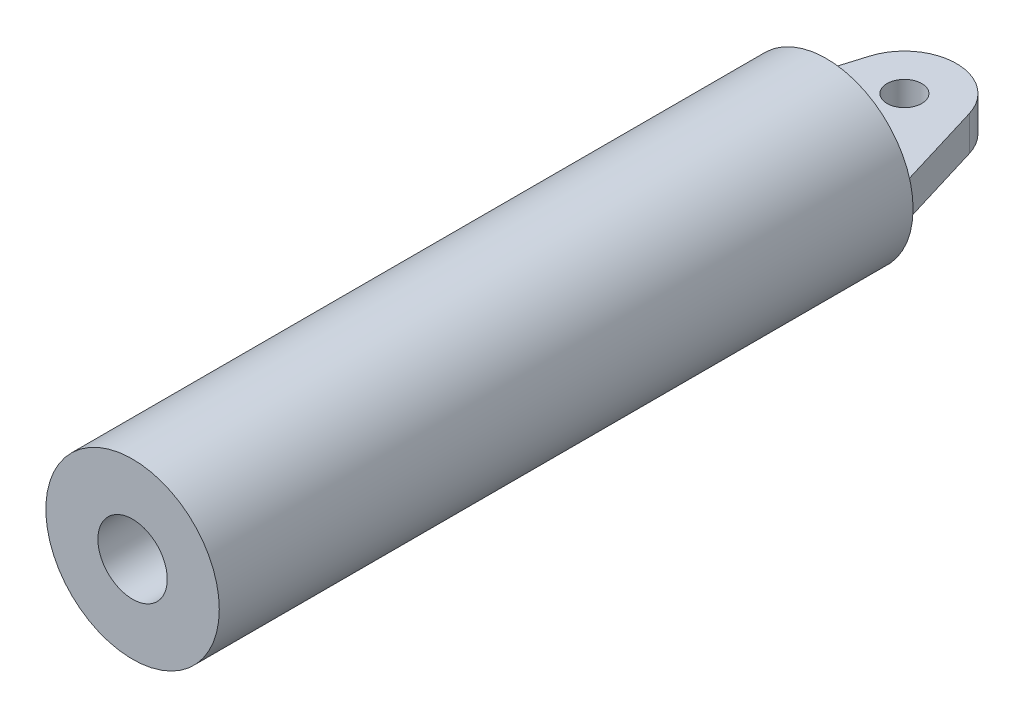
ISO-10303-21;
HEADER;
FILE_DESCRIPTION(('STEP AP214'),'2;1');
FILE_NAME('part.step','',(''),(''),'','','');
FILE_SCHEMA(('AUTOMOTIVE_DESIGN { 1 0 10303 214 1 1 1 1 }'));
ENDSEC;
DATA;
#1=APPLICATION_CONTEXT('core data for automotive mechanical design processes');
#2=APPLICATION_PROTOCOL_DEFINITION('international standard','automotive_design',2000,#1);
#3=PRODUCT_CONTEXT('',#1,'mechanical');
#4=PRODUCT('Part','Part','',(#3));
#5=PRODUCT_RELATED_PRODUCT_CATEGORY('part','',(#4));
#6=PRODUCT_DEFINITION_FORMATION('','',#4);
#7=PRODUCT_DEFINITION_CONTEXT('part definition',#1,'design');
#8=PRODUCT_DEFINITION('design','',#6,#7);
#9=PRODUCT_DEFINITION_SHAPE('','',#8);
#10=(LENGTH_UNIT() NAMED_UNIT(*) SI_UNIT(.MILLI.,.METRE.));
#11=(NAMED_UNIT(*) PLANE_ANGLE_UNIT() SI_UNIT($,.RADIAN.));
#12=(NAMED_UNIT(*) SI_UNIT($,.STERADIAN.) SOLID_ANGLE_UNIT());
#13=UNCERTAINTY_MEASURE_WITH_UNIT(LENGTH_MEASURE(1.E-05),#10,'distance_accuracy_value','');
#14=(GEOMETRIC_REPRESENTATION_CONTEXT(3) GLOBAL_UNCERTAINTY_ASSIGNED_CONTEXT((#13)) GLOBAL_UNIT_ASSIGNED_CONTEXT((#10,
#11,#12)) REPRESENTATION_CONTEXT('',''));
#15=CARTESIAN_POINT('',(0.,0.,0.));
#16=DIRECTION('',(0.,0.,1.));
#17=DIRECTION('',(1.,0.,0.));
#18=AXIS2_PLACEMENT_3D('',#15,#16,#17);
#19=CARTESIAN_POINT('',(0.,0.,400.));
#20=DIRECTION('',(0.,0.,-1.));
#21=DIRECTION('',(-1.,0.,0.));
#22=AXIS2_PLACEMENT_3D('',#19,#20,#21);
#23=CYLINDRICAL_SURFACE('',#22,50.);
#24=CARTESIAN_POINT('',(0.,0.,400.));
#25=DIRECTION('',(0.,0.,1.));
#26=DIRECTION('',(1.,0.,0.));
#27=AXIS2_PLACEMENT_3D('',#24,#25,#26);
#28=CIRCLE('',#27,50.);
#29=CARTESIAN_POINT('',(50.,0.,400.));
#30=VERTEX_POINT('',#29);
#31=EDGE_CURVE('E11',#30,#30,#28,.T.);
#32=ORIENTED_EDGE('',*,*,#31,.F.);
#33=EDGE_LOOP('',(#32));
#34=FACE_BOUND('',#33,.T.);
#35=CARTESIAN_POINT('',(0.,0.,0.));
#36=DIRECTION('',(0.,0.,1.));
#37=DIRECTION('',(1.,0.,0.));
#38=AXIS2_PLACEMENT_3D('',#35,#36,#37);
#39=CIRCLE('',#38,50.);
#40=CARTESIAN_POINT('',(50.,0.,0.));
#41=VERTEX_POINT('',#40);
#42=EDGE_CURVE('E42',#41,#41,#39,.T.);
#43=ORIENTED_EDGE('',*,*,#42,.T.);
#44=EDGE_LOOP('',(#43));
#45=FACE_BOUND('',#44,.T.);
#46=ADVANCED_FACE('F39',(#34,#45),#23,.T.);
#47=CARTESIAN_POINT('',(0.,0.,400.));
#48=DIRECTION('',(0.,0.,1.));
#49=DIRECTION('',(1.,0.,0.));
#50=AXIS2_PLACEMENT_3D('',#47,#48,#49);
#51=PLANE('',#50);
#52=CARTESIAN_POINT('',(0.,0.,400.));
#53=DIRECTION('',(0.,0.,1.));
#54=DIRECTION('',(1.,0.,0.));
#55=AXIS2_PLACEMENT_3D('',#52,#53,#54);
#56=CIRCLE('',#55,20.);
#57=CARTESIAN_POINT('',(20.,0.,400.));
#58=VERTEX_POINT('',#57);
#59=EDGE_CURVE('E134',#58,#58,#56,.T.);
#60=ORIENTED_EDGE('',*,*,#59,.F.);
#61=EDGE_LOOP('',(#60));
#62=FACE_BOUND('',#61,.T.);
#63=ORIENTED_EDGE('',*,*,#31,.T.);
#64=EDGE_LOOP('',(#63));
#65=FACE_BOUND('',#64,.T.);
#66=ADVANCED_FACE('F147',(#62,#65),#51,.T.);
#67=CARTESIAN_POINT('',(0.,0.,0.));
#68=DIRECTION('',(0.,0.,1.));
#69=DIRECTION('',(1.,0.,0.));
#70=AXIS2_PLACEMENT_3D('',#67,#68,#69);
#71=PLANE('',#70);
#72=DIRECTION('',(0.,-1.,0.));
#73=VECTOR('',#72,1.);
#74=CARTESIAN_POINT('',(-45.,10.,0.));
#75=LINE('',#74,#73);
#76=CARTESIAN_POINT('',(-45.,10.,0.));
#77=VERTEX_POINT('',#76);
#78=CARTESIAN_POINT('',(-45.,-10.,0.));
#79=VERTEX_POINT('',#78);
#80=EDGE_CURVE('E109',#77,#79,#75,.T.);
#81=ORIENTED_EDGE('',*,*,#80,.T.);
#82=DIRECTION('',(1.,0.,0.));
#83=VECTOR('',#82,1.);
#84=CARTESIAN_POINT('',(-45.,-10.,0.));
#85=LINE('',#84,#83);
#86=CARTESIAN_POINT('',(45.,-10.,0.));
#87=VERTEX_POINT('',#86);
#88=EDGE_CURVE('E54',#79,#87,#85,.T.);
#89=ORIENTED_EDGE('',*,*,#88,.T.);
#90=DIRECTION('',(0.,-1.,0.));
#91=VECTOR('',#90,1.);
#92=CARTESIAN_POINT('',(45.,10.,0.));
#93=LINE('',#92,#91);
#94=CARTESIAN_POINT('',(45.,10.,0.));
#95=VERTEX_POINT('',#94);
#96=EDGE_CURVE('E102',#95,#87,#93,.T.);
#97=ORIENTED_EDGE('',*,*,#96,.F.);
#98=DIRECTION('',(1.,0.,0.));
#99=VECTOR('',#98,1.);
#100=CARTESIAN_POINT('',(-45.,10.,0.));
#101=LINE('',#100,#99);
#102=EDGE_CURVE('E94',#77,#95,#101,.T.);
#103=ORIENTED_EDGE('',*,*,#102,.F.);
#104=EDGE_LOOP('',(#81,#89,#97,#103));
#105=FACE_BOUND('',#104,.T.);
#106=ORIENTED_EDGE('',*,*,#42,.F.);
#107=EDGE_LOOP('',(#106));
#108=FACE_BOUND('',#107,.T.);
#109=ADVANCED_FACE('F144',(#105,#108),#71,.F.);
#110=CARTESIAN_POINT('',(0.,0.,400.));
#111=DIRECTION('',(0.,0.,-1.));
#112=DIRECTION('',(-1.,0.,0.));
#113=AXIS2_PLACEMENT_3D('',#110,#111,#112);
#114=CYLINDRICAL_SURFACE('',#113,20.);
#115=ORIENTED_EDGE('',*,*,#59,.T.);
#116=EDGE_LOOP('',(#115));
#117=FACE_BOUND('',#116,.T.);
#118=CARTESIAN_POINT('',(0.,0.,30.));
#119=DIRECTION('',(0.,0.,1.));
#120=DIRECTION('',(1.,0.,0.));
#121=AXIS2_PLACEMENT_3D('',#118,#119,#120);
#122=CIRCLE('',#121,20.);
#123=CARTESIAN_POINT('',(20.,0.,30.));
#124=VERTEX_POINT('',#123);
#125=EDGE_CURVE('E130',#124,#124,#122,.T.);
#126=ORIENTED_EDGE('',*,*,#125,.F.);
#127=EDGE_LOOP('',(#126));
#128=FACE_BOUND('',#127,.T.);
#129=ADVANCED_FACE('F146',(#117,#128),#114,.F.);
#130=CARTESIAN_POINT('',(0.,0.,30.));
#131=DIRECTION('',(0.,0.,1.));
#132=DIRECTION('',(1.,0.,0.));
#133=AXIS2_PLACEMENT_3D('',#130,#131,#132);
#134=PLANE('',#133);
#135=ORIENTED_EDGE('',*,*,#125,.T.);
#136=EDGE_LOOP('',(#135));
#137=FACE_BOUND('',#136,.T.);
#138=ADVANCED_FACE('F153',(#137),#134,.T.);
#139=CARTESIAN_POINT('',(0.,10.,-45.));
#140=DIRECTION('',(0.,-1.,0.));
#141=DIRECTION('',(0.,0.,-1.));
#142=AXIS2_PLACEMENT_3D('',#139,#140,#141);
#143=PLANE('',#142);
#144=ORIENTED_EDGE('',*,*,#102,.T.);
#145=DIRECTION('',(-0.29027623112899,0.,-0.956942897795657));
#146=VECTOR('',#145,1.);
#147=CARTESIAN_POINT('',(28.7082869338697,10.,-53.7082869338697));
#148=LINE('',#147,#146);
#149=CARTESIAN_POINT('',(28.7082869338697,10.,-53.7082869338697));
#150=VERTEX_POINT('',#149);
#151=EDGE_CURVE('E88',#95,#150,#148,.T.);
#152=ORIENTED_EDGE('',*,*,#151,.T.);
#153=CARTESIAN_POINT('',(0.,10.,-45.));
#154=DIRECTION('',(0.,1.,0.));
#155=DIRECTION('',(0.,0.,-1.));
#156=AXIS2_PLACEMENT_3D('',#153,#154,#155);
#157=CIRCLE('',#156,30.);
#158=CARTESIAN_POINT('',(-28.7082869338697,10.,-53.7082869338697));
#159=VERTEX_POINT('',#158);
#160=EDGE_CURVE('E92',#150,#159,#157,.T.);
#161=ORIENTED_EDGE('',*,*,#160,.T.);
#162=DIRECTION('',(-0.29027623112899,0.,0.956942897795657));
#163=VECTOR('',#162,1.);
#164=CARTESIAN_POINT('',(-45.,10.,0.));
#165=LINE('',#164,#163);
#166=EDGE_CURVE('E63',#159,#77,#165,.T.);
#167=ORIENTED_EDGE('',*,*,#166,.T.);
#168=EDGE_LOOP('',(#144,#152,#161,#167));
#169=FACE_BOUND('',#168,.T.);
#170=CARTESIAN_POINT('',(0.,10.,-45.));
#171=DIRECTION('',(0.,1.,0.));
#172=DIRECTION('',(0.,0.,1.));
#173=AXIS2_PLACEMENT_3D('',#170,#171,#172);
#174=CIRCLE('',#173,10.);
#175=CARTESIAN_POINT('',(0.,10.,-35.));
#176=VERTEX_POINT('',#175);
#177=EDGE_CURVE('E115',#176,#176,#174,.T.);
#178=ORIENTED_EDGE('',*,*,#177,.F.);
#179=EDGE_LOOP('',(#178));
#180=FACE_BOUND('',#179,.T.);
#181=ADVANCED_FACE('F89',(#169,#180),#143,.F.);
#182=CARTESIAN_POINT('',(0.,-10.,-45.));
#183=DIRECTION('',(0.,-1.,0.));
#184=DIRECTION('',(0.,0.,-1.));
#185=AXIS2_PLACEMENT_3D('',#182,#183,#184);
#186=PLANE('',#185);
#187=ORIENTED_EDGE('',*,*,#88,.F.);
#188=DIRECTION('',(-0.29027623112899,0.,0.956942897795657));
#189=VECTOR('',#188,1.);
#190=CARTESIAN_POINT('',(-45.,-10.,0.));
#191=LINE('',#190,#189);
#192=CARTESIAN_POINT('',(-28.7082869338697,-10.,-53.7082869338697));
#193=VERTEX_POINT('',#192);
#194=EDGE_CURVE('E120',#193,#79,#191,.T.);
#195=ORIENTED_EDGE('',*,*,#194,.F.);
#196=CARTESIAN_POINT('',(0.,-10.,-45.));
#197=DIRECTION('',(0.,1.,0.));
#198=DIRECTION('',(0.,0.,-1.));
#199=AXIS2_PLACEMENT_3D('',#196,#197,#198);
#200=CIRCLE('',#199,30.);
#201=CARTESIAN_POINT('',(28.7082869338697,-10.,-53.7082869338697));
#202=VERTEX_POINT('',#201);
#203=EDGE_CURVE('E80',#202,#193,#200,.T.);
#204=ORIENTED_EDGE('',*,*,#203,.F.);
#205=DIRECTION('',(-0.29027623112899,0.,-0.956942897795657));
#206=VECTOR('',#205,1.);
#207=CARTESIAN_POINT('',(28.7082869338697,-10.,-53.7082869338697));
#208=LINE('',#207,#206);
#209=EDGE_CURVE('E100',#87,#202,#208,.T.);
#210=ORIENTED_EDGE('',*,*,#209,.F.);
#211=EDGE_LOOP('',(#187,#195,#204,#210));
#212=FACE_BOUND('',#211,.T.);
#213=CARTESIAN_POINT('',(0.,-10.,-45.));
#214=DIRECTION('',(0.,1.,0.));
#215=DIRECTION('',(0.,0.,1.));
#216=AXIS2_PLACEMENT_3D('',#213,#214,#215);
#217=CIRCLE('',#216,10.);
#218=CARTESIAN_POINT('',(0.,-10.,-35.));
#219=VERTEX_POINT('',#218);
#220=EDGE_CURVE('E248',#219,#219,#217,.T.);
#221=ORIENTED_EDGE('',*,*,#220,.T.);
#222=EDGE_LOOP('',(#221));
#223=FACE_BOUND('',#222,.T.);
#224=ADVANCED_FACE('F195',(#212,#223),#186,.T.);
#225=CARTESIAN_POINT('',(28.7082869338697,10.,-53.7082869338697));
#226=DIRECTION('',(-0.956942897795657,0.,0.29027623112899));
#227=DIRECTION('',(0.29027623112899,0.,0.956942897795657));
#228=AXIS2_PLACEMENT_3D('',#225,#226,#227);
#229=PLANE('',#228);
#230=ORIENTED_EDGE('',*,*,#209,.T.);
#231=DIRECTION('',(0.,-1.,0.));
#232=VECTOR('',#231,1.);
#233=CARTESIAN_POINT('',(28.7082869338697,10.,-53.7082869338697));
#234=LINE('',#233,#232);
#235=EDGE_CURVE('E98',#150,#202,#234,.T.);
#236=ORIENTED_EDGE('',*,*,#235,.F.);
#237=ORIENTED_EDGE('',*,*,#151,.F.);
#238=ORIENTED_EDGE('',*,*,#96,.T.);
#239=EDGE_LOOP('',(#230,#236,#237,#238));
#240=FACE_BOUND('',#239,.T.);
#241=ADVANCED_FACE('F99',(#240),#229,.F.);
#242=CARTESIAN_POINT('',(0.,10.,-45.));
#243=DIRECTION('',(0.,-1.,0.));
#244=DIRECTION('',(0.,0.,-1.));
#245=AXIS2_PLACEMENT_3D('',#242,#243,#244);
#246=CYLINDRICAL_SURFACE('',#245,30.);
#247=ORIENTED_EDGE('',*,*,#203,.T.);
#248=DIRECTION('',(0.,-1.,0.));
#249=VECTOR('',#248,1.);
#250=CARTESIAN_POINT('',(-28.7082869338697,10.,-53.7082869338697));
#251=LINE('',#250,#249);
#252=EDGE_CURVE('E103',#159,#193,#251,.T.);
#253=ORIENTED_EDGE('',*,*,#252,.F.);
#254=ORIENTED_EDGE('',*,*,#160,.F.);
#255=ORIENTED_EDGE('',*,*,#235,.T.);
#256=EDGE_LOOP('',(#247,#253,#254,#255));
#257=FACE_BOUND('',#256,.T.);
#258=ADVANCED_FACE('F105',(#257),#246,.T.);
#259=CARTESIAN_POINT('',(-45.,10.,0.));
#260=DIRECTION('',(0.956942897795657,0.,0.29027623112899));
#261=DIRECTION('',(0.29027623112899,0.,-0.956942897795657));
#262=AXIS2_PLACEMENT_3D('',#259,#260,#261);
#263=PLANE('',#262);
#264=ORIENTED_EDGE('',*,*,#194,.T.);
#265=ORIENTED_EDGE('',*,*,#80,.F.);
#266=ORIENTED_EDGE('',*,*,#166,.F.);
#267=ORIENTED_EDGE('',*,*,#252,.T.);
#268=EDGE_LOOP('',(#264,#265,#266,#267));
#269=FACE_BOUND('',#268,.T.);
#270=ADVANCED_FACE('F220',(#269),#263,.F.);
#271=CARTESIAN_POINT('',(0.,10.,-45.));
#272=DIRECTION('',(0.,-1.,0.));
#273=DIRECTION('',(0.,0.,-1.));
#274=AXIS2_PLACEMENT_3D('',#271,#272,#273);
#275=CYLINDRICAL_SURFACE('',#274,10.);
#276=ORIENTED_EDGE('',*,*,#177,.T.);
#277=EDGE_LOOP('',(#276));
#278=FACE_BOUND('',#277,.T.);
#279=ORIENTED_EDGE('',*,*,#220,.F.);
#280=EDGE_LOOP('',(#279));
#281=FACE_BOUND('',#280,.T.);
#282=ADVANCED_FACE('F229',(#278,#281),#275,.F.);
#283=CLOSED_SHELL('',(#46,#66,#109,#129,#138,#181,#224,#241,#258,#270,#282));
#284=MANIFOLD_SOLID_BREP('B2',#283);
#285=ADVANCED_BREP_SHAPE_REPRESENTATION('',(#18,#284),#14);
#286=SHAPE_DEFINITION_REPRESENTATION(#9,#285);
ENDSEC;
END-ISO-10303-21;
